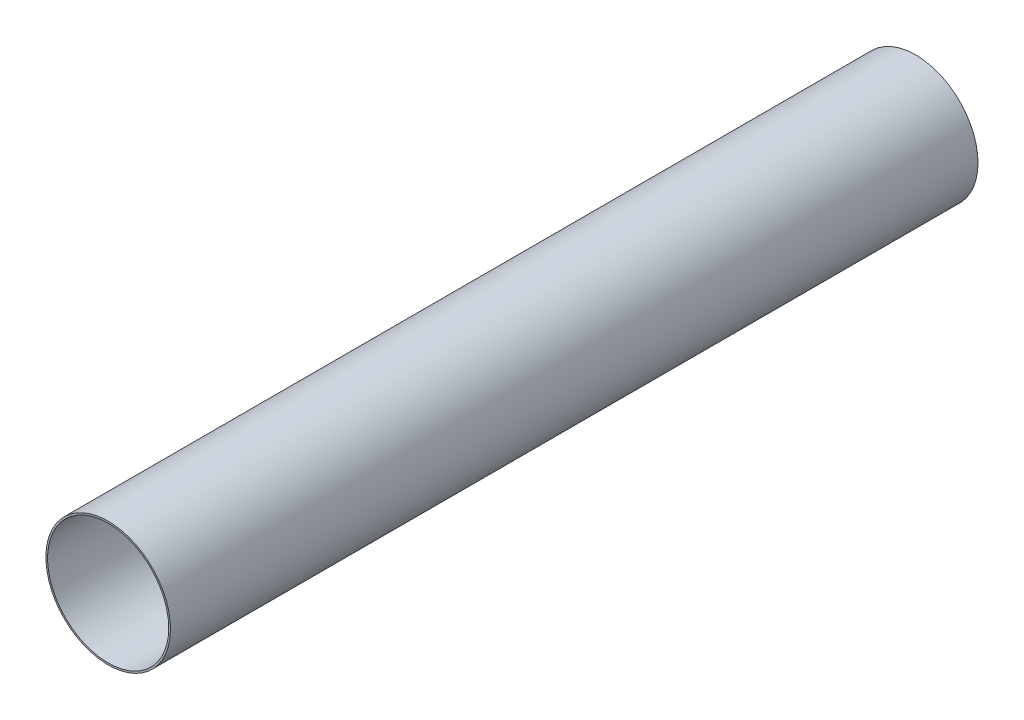
ISO-10303-21;
HEADER;
FILE_DESCRIPTION(('STEP AP214'),'2;1');
FILE_NAME('part.step','',(''),(''),'','','');
FILE_SCHEMA(('AUTOMOTIVE_DESIGN { 1 0 10303 214 1 1 1 1 }'));
ENDSEC;
DATA;
#1=APPLICATION_CONTEXT('core data for automotive mechanical design processes');
#2=APPLICATION_PROTOCOL_DEFINITION('international standard','automotive_design',2000,#1);
#3=PRODUCT_CONTEXT('',#1,'mechanical');
#4=PRODUCT('Part','Part','',(#3));
#5=PRODUCT_RELATED_PRODUCT_CATEGORY('part','',(#4));
#6=PRODUCT_DEFINITION_FORMATION('','',#4);
#7=PRODUCT_DEFINITION_CONTEXT('part definition',#1,'design');
#8=PRODUCT_DEFINITION('design','',#6,#7);
#9=PRODUCT_DEFINITION_SHAPE('','',#8);
#10=(LENGTH_UNIT() NAMED_UNIT(*) SI_UNIT(.MILLI.,.METRE.));
#11=(NAMED_UNIT(*) PLANE_ANGLE_UNIT() SI_UNIT($,.RADIAN.));
#12=(NAMED_UNIT(*) SI_UNIT($,.STERADIAN.) SOLID_ANGLE_UNIT());
#13=UNCERTAINTY_MEASURE_WITH_UNIT(LENGTH_MEASURE(1.E-05),#10,'distance_accuracy_value','');
#14=(GEOMETRIC_REPRESENTATION_CONTEXT(3) GLOBAL_UNCERTAINTY_ASSIGNED_CONTEXT((#13)) GLOBAL_UNIT_ASSIGNED_CONTEXT((#10,
#11,#12)) REPRESENTATION_CONTEXT('',''));
#15=CARTESIAN_POINT('',(0.,0.,0.));
#16=DIRECTION('',(0.,0.,1.));
#17=DIRECTION('',(1.,0.,0.));
#18=AXIS2_PLACEMENT_3D('',#15,#16,#17);
#19=CARTESIAN_POINT('',(0.,0.,1016.));
#20=DIRECTION('',(0.,0.,1.));
#21=DIRECTION('',(1.,0.,0.));
#22=AXIS2_PLACEMENT_3D('',#19,#20,#21);
#23=PLANE('',#22);
#24=CARTESIAN_POINT('',(0.,0.,1016.));
#25=DIRECTION('',(0.,0.,1.));
#26=DIRECTION('',(1.,0.,0.));
#27=AXIS2_PLACEMENT_3D('',#24,#25,#26);
#28=CIRCLE('',#27,78.359);
#29=CARTESIAN_POINT('',(78.359,0.,1016.));
#30=VERTEX_POINT('',#29);
#31=EDGE_CURVE('E10',#30,#30,#28,.T.);
#32=ORIENTED_EDGE('',*,*,#31,.T.);
#33=EDGE_LOOP('',(#32));
#34=FACE_BOUND('',#33,.T.);
#35=CARTESIAN_POINT('',(0.,0.,1016.));
#36=DIRECTION('',(0.,0.,1.));
#37=DIRECTION('',(1.,0.,0.));
#38=AXIS2_PLACEMENT_3D('',#35,#36,#37);
#39=CIRCLE('',#38,76.2);
#40=CARTESIAN_POINT('',(76.2,0.,1016.));
#41=VERTEX_POINT('',#40);
#42=EDGE_CURVE('E42',#41,#41,#39,.T.);
#43=ORIENTED_EDGE('',*,*,#42,.F.);
#44=EDGE_LOOP('',(#43));
#45=FACE_BOUND('',#44,.T.);
#46=ADVANCED_FACE('F31',(#34,#45),#23,.T.);
#47=CARTESIAN_POINT('',(0.,0.,0.));
#48=DIRECTION('',(0.,0.,1.));
#49=DIRECTION('',(1.,0.,0.));
#50=AXIS2_PLACEMENT_3D('',#47,#48,#49);
#51=PLANE('',#50);
#52=CARTESIAN_POINT('',(0.,0.,0.));
#53=DIRECTION('',(0.,0.,1.));
#54=DIRECTION('',(1.,0.,0.));
#55=AXIS2_PLACEMENT_3D('',#52,#53,#54);
#56=CIRCLE('',#55,78.359);
#57=CARTESIAN_POINT('',(78.359,0.,0.));
#58=VERTEX_POINT('',#57);
#59=EDGE_CURVE('E35',#58,#58,#56,.T.);
#60=ORIENTED_EDGE('',*,*,#59,.F.);
#61=EDGE_LOOP('',(#60));
#62=FACE_BOUND('',#61,.T.);
#63=CARTESIAN_POINT('',(0.,0.,0.));
#64=DIRECTION('',(0.,0.,1.));
#65=DIRECTION('',(1.,0.,0.));
#66=AXIS2_PLACEMENT_3D('',#63,#64,#65);
#67=CIRCLE('',#66,76.2);
#68=CARTESIAN_POINT('',(76.2,0.,0.));
#69=VERTEX_POINT('',#68);
#70=EDGE_CURVE('E44',#69,#69,#67,.T.);
#71=ORIENTED_EDGE('',*,*,#70,.T.);
#72=EDGE_LOOP('',(#71));
#73=FACE_BOUND('',#72,.T.);
#74=ADVANCED_FACE('F54',(#62,#73),#51,.F.);
#75=CARTESIAN_POINT('',(0.,0.,1016.));
#76=DIRECTION('',(0.,0.,-1.));
#77=DIRECTION('',(-1.,0.,0.));
#78=AXIS2_PLACEMENT_3D('',#75,#76,#77);
#79=CYLINDRICAL_SURFACE('',#78,78.359);
#80=ORIENTED_EDGE('',*,*,#31,.F.);
#81=EDGE_LOOP('',(#80));
#82=FACE_BOUND('',#81,.T.);
#83=ORIENTED_EDGE('',*,*,#59,.T.);
#84=EDGE_LOOP('',(#83));
#85=FACE_BOUND('',#84,.T.);
#86=ADVANCED_FACE('F33',(#82,#85),#79,.T.);
#87=CARTESIAN_POINT('',(0.,0.,1016.));
#88=DIRECTION('',(0.,0.,-1.));
#89=DIRECTION('',(-1.,0.,0.));
#90=AXIS2_PLACEMENT_3D('',#87,#88,#89);
#91=CYLINDRICAL_SURFACE('',#90,76.2);
#92=ORIENTED_EDGE('',*,*,#42,.T.);
#93=EDGE_LOOP('',(#92));
#94=FACE_BOUND('',#93,.T.);
#95=ORIENTED_EDGE('',*,*,#70,.F.);
#96=EDGE_LOOP('',(#95));
#97=FACE_BOUND('',#96,.T.);
#98=ADVANCED_FACE('F50',(#94,#97),#91,.F.);
#99=CLOSED_SHELL('',(#46,#74,#86,#98));
#100=MANIFOLD_SOLID_BREP('B2',#99);
#101=ADVANCED_BREP_SHAPE_REPRESENTATION('',(#18,#100),#14);
#102=SHAPE_DEFINITION_REPRESENTATION(#9,#101);
ENDSEC;
END-ISO-10303-21;
